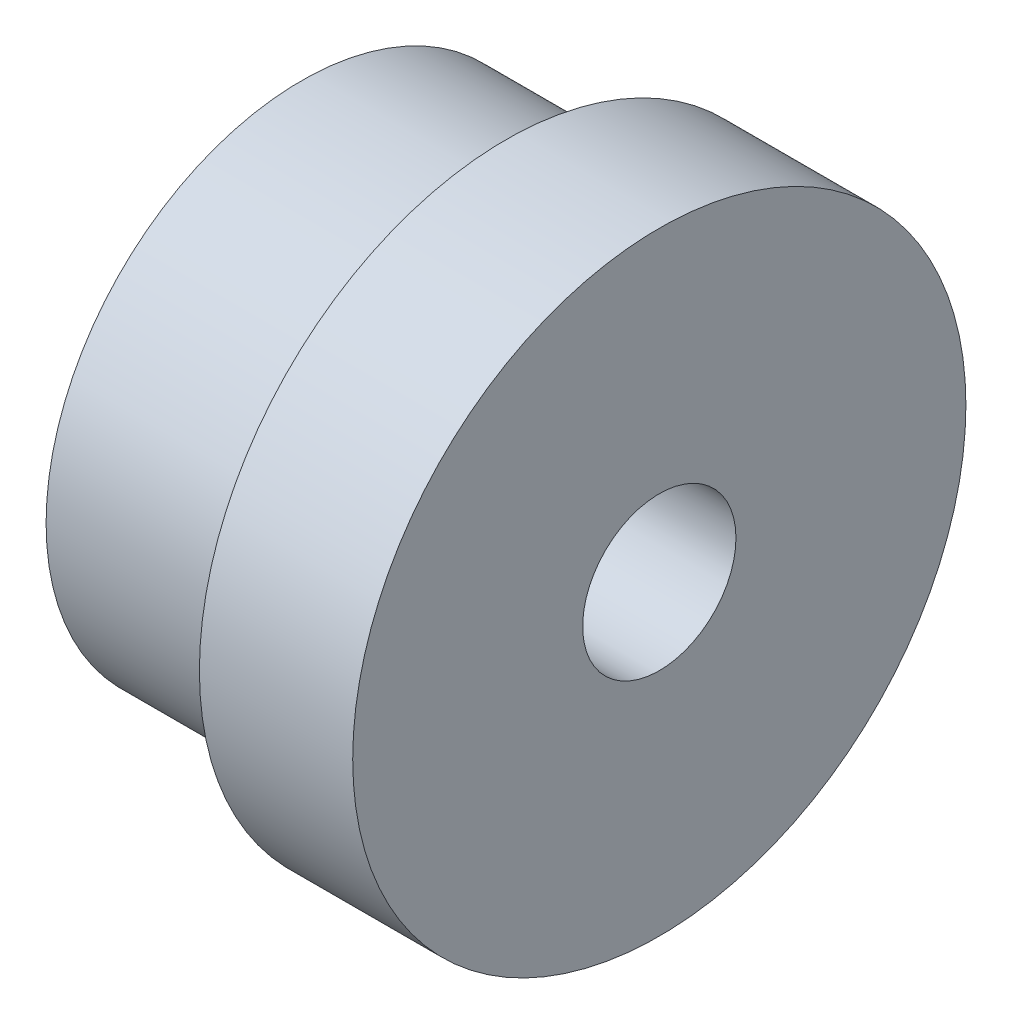
ISO-10303-21;
HEADER;
FILE_DESCRIPTION(('STEP AP214'),'2;1');
FILE_NAME('part.step','',(''),(''),'','','');
FILE_SCHEMA(('AUTOMOTIVE_DESIGN { 1 0 10303 214 1 1 1 1 }'));
ENDSEC;
DATA;
#1=APPLICATION_CONTEXT('core data for automotive mechanical design processes');
#2=APPLICATION_PROTOCOL_DEFINITION('international standard','automotive_design',2000,#1);
#3=PRODUCT_CONTEXT('',#1,'mechanical');
#4=PRODUCT('Part','Part','',(#3));
#5=PRODUCT_RELATED_PRODUCT_CATEGORY('part','',(#4));
#6=PRODUCT_DEFINITION_FORMATION('','',#4);
#7=PRODUCT_DEFINITION_CONTEXT('part definition',#1,'design');
#8=PRODUCT_DEFINITION('design','',#6,#7);
#9=PRODUCT_DEFINITION_SHAPE('','',#8);
#10=(LENGTH_UNIT() NAMED_UNIT(*) SI_UNIT(.MILLI.,.METRE.));
#11=(NAMED_UNIT(*) PLANE_ANGLE_UNIT() SI_UNIT($,.RADIAN.));
#12=(NAMED_UNIT(*) SI_UNIT($,.STERADIAN.) SOLID_ANGLE_UNIT());
#13=UNCERTAINTY_MEASURE_WITH_UNIT(LENGTH_MEASURE(1.E-05),#10,'distance_accuracy_value','');
#14=(GEOMETRIC_REPRESENTATION_CONTEXT(3) GLOBAL_UNCERTAINTY_ASSIGNED_CONTEXT((#13)) GLOBAL_UNIT_ASSIGNED_CONTEXT((#10,
#11,#12)) REPRESENTATION_CONTEXT('',''));
#15=CARTESIAN_POINT('',(0.,0.,0.));
#16=DIRECTION('',(0.,0.,1.));
#17=DIRECTION('',(1.,0.,0.));
#18=AXIS2_PLACEMENT_3D('',#15,#16,#17);
#19=CARTESIAN_POINT('',(0.,0.,0.));
#20=DIRECTION('',(1.,0.,0.));
#21=DIRECTION('',(0.,0.,-1.));
#22=AXIS2_PLACEMENT_3D('',#19,#20,#21);
#23=PLANE('',#22);
#24=CARTESIAN_POINT('',(0.,0.,0.));
#25=DIRECTION('',(1.,0.,0.));
#26=DIRECTION('',(0.,0.,-1.));
#27=AXIS2_PLACEMENT_3D('',#24,#25,#26);
#28=CIRCLE('',#27,9.525);
#29=CARTESIAN_POINT('',(0.,0.,9.525));
#30=VERTEX_POINT('',#29);
#31=EDGE_CURVE('E42',#30,#30,#28,.T.);
#32=ORIENTED_EDGE('',*,*,#31,.F.);
#33=EDGE_LOOP('',(#32));
#34=FACE_BOUND('',#33,.T.);
#35=CARTESIAN_POINT('',(0.,0.,0.));
#36=DIRECTION('',(1.,0.,0.));
#37=DIRECTION('',(0.,0.,-1.));
#38=AXIS2_PLACEMENT_3D('',#35,#36,#37);
#39=CIRCLE('',#38,7.9375);
#40=CARTESIAN_POINT('',(0.,0.,-7.9375));
#41=VERTEX_POINT('',#40);
#42=EDGE_CURVE('E10',#41,#41,#39,.F.);
#43=ORIENTED_EDGE('',*,*,#42,.F.);
#44=EDGE_LOOP('',(#43));
#45=FACE_BOUND('',#44,.T.);
#46=ADVANCED_FACE('F31',(#34,#45),#23,.F.);
#47=CARTESIAN_POINT('',(4.7625,0.,0.));
#48=DIRECTION('',(-1.,0.,0.));
#49=DIRECTION('',(0.,0.,1.));
#50=AXIS2_PLACEMENT_3D('',#47,#48,#49);
#51=CYLINDRICAL_SURFACE('',#50,9.525);
#52=CARTESIAN_POINT('',(4.7625,0.,0.));
#53=DIRECTION('',(1.,0.,0.));
#54=DIRECTION('',(0.,0.,-1.));
#55=AXIS2_PLACEMENT_3D('',#52,#53,#54);
#56=CIRCLE('',#55,9.525);
#57=CARTESIAN_POINT('',(4.7625,0.,9.525));
#58=VERTEX_POINT('',#57);
#59=EDGE_CURVE('E38',#58,#58,#56,.T.);
#60=CARTESIAN_POINT('',(4.7625,0.,9.525));
#61=CARTESIAN_POINT('',(4.712890625,0.,9.525));
#62=CARTESIAN_POINT('',(4.66328125,0.,9.525));
#63=CARTESIAN_POINT('',(4.5640625,0.,9.525));
#64=CARTESIAN_POINT('',(4.514453125,0.,9.525));
#65=CARTESIAN_POINT('',(4.415234375,0.,9.525));
#66=CARTESIAN_POINT('',(4.365625,0.,9.525));
#67=CARTESIAN_POINT('',(4.26640625,0.,9.525));
#68=CARTESIAN_POINT('',(4.216796875,0.,9.525));
#69=CARTESIAN_POINT('',(4.117578125,0.,9.525));
#70=CARTESIAN_POINT('',(4.06796875,0.,9.525));
#71=CARTESIAN_POINT('',(3.96875,0.,9.525));
#72=CARTESIAN_POINT('',(3.919140625,0.,9.525));
#73=CARTESIAN_POINT('',(3.819921875,0.,9.525));
#74=CARTESIAN_POINT('',(3.7703125,0.,9.525));
#75=CARTESIAN_POINT('',(3.67109375,0.,9.525));
#76=CARTESIAN_POINT('',(3.621484375,0.,9.525));
#77=CARTESIAN_POINT('',(3.522265625,0.,9.525));
#78=CARTESIAN_POINT('',(3.47265625,0.,9.525));
#79=CARTESIAN_POINT('',(3.3734375,0.,9.525));
#80=CARTESIAN_POINT('',(3.323828125,0.,9.525));
#81=CARTESIAN_POINT('',(3.224609375,0.,9.525));
#82=CARTESIAN_POINT('',(3.175,0.,9.525));
#83=CARTESIAN_POINT('',(3.07578125,0.,9.525));
#84=CARTESIAN_POINT('',(3.026171875,0.,9.525));
#85=CARTESIAN_POINT('',(2.926953125,0.,9.525));
#86=CARTESIAN_POINT('',(2.87734375,0.,9.525));
#87=CARTESIAN_POINT('',(2.778125,0.,9.525));
#88=CARTESIAN_POINT('',(2.728515625,0.,9.525));
#89=CARTESIAN_POINT('',(2.629296875,0.,9.525));
#90=CARTESIAN_POINT('',(2.5796875,0.,9.525));
#91=CARTESIAN_POINT('',(2.48046875,0.,9.525));
#92=CARTESIAN_POINT('',(2.430859375,0.,9.525));
#93=CARTESIAN_POINT('',(2.331640625,0.,9.525));
#94=CARTESIAN_POINT('',(2.28203125,0.,9.525));
#95=CARTESIAN_POINT('',(2.1828125,0.,9.525));
#96=CARTESIAN_POINT('',(2.133203125,0.,9.525));
#97=CARTESIAN_POINT('',(2.033984375,0.,9.525));
#98=CARTESIAN_POINT('',(1.984375,0.,9.525));
#99=CARTESIAN_POINT('',(1.88515625,0.,9.525));
#100=CARTESIAN_POINT('',(1.835546875,0.,9.525));
#101=CARTESIAN_POINT('',(1.736328125,0.,9.525));
#102=CARTESIAN_POINT('',(1.68671875,0.,9.525));
#103=CARTESIAN_POINT('',(1.5875,0.,9.525));
#104=CARTESIAN_POINT('',(1.537890625,0.,9.525));
#105=CARTESIAN_POINT('',(1.438671875,0.,9.525));
#106=CARTESIAN_POINT('',(1.3890625,0.,9.525));
#107=CARTESIAN_POINT('',(1.28984375,0.,9.525));
#108=CARTESIAN_POINT('',(1.240234375,0.,9.525));
#109=CARTESIAN_POINT('',(1.141015625,0.,9.525));
#110=CARTESIAN_POINT('',(1.09140625,0.,9.525));
#111=CARTESIAN_POINT('',(0.992187499999999,0.,9.525));
#112=CARTESIAN_POINT('',(0.942578124999999,0.,9.525));
#113=CARTESIAN_POINT('',(0.843359375,0.,9.525));
#114=CARTESIAN_POINT('',(0.79375,0.,9.525));
#115=CARTESIAN_POINT('',(0.69453125,0.,9.525));
#116=CARTESIAN_POINT('',(0.644921875,0.,9.525));
#117=CARTESIAN_POINT('',(0.545703125,0.,9.525));
#118=CARTESIAN_POINT('',(0.49609375,0.,9.525));
#119=CARTESIAN_POINT('',(0.396875,0.,9.525));
#120=CARTESIAN_POINT('',(0.347265625,0.,9.525));
#121=CARTESIAN_POINT('',(0.248046875,0.,9.525));
#122=CARTESIAN_POINT('',(0.1984375,0.,9.525));
#123=CARTESIAN_POINT('',(0.09921875,0.,9.525));
#124=CARTESIAN_POINT('',(0.049609375,0.,9.525));
#125=CARTESIAN_POINT('',(0.,0.,9.525));
#126=B_SPLINE_CURVE_WITH_KNOTS('',3,(#60,#61,#62,#63,#64,#65,#66,#67,#68,#69,#70,#71,#72,#73,
#74,#75,#76,#77,#78,#79,#80,#81,#82,#83,#84,#85,#86,#87,#88,#89,#90,#91,#92,#93,#94,#95,#96,#97,
#98,#99,#100,#101,#102,#103,#104,#105,#106,#107,#108,#109,#110,#111,#112,#113,#114,#115,#116,
#117,#118,#119,#120,#121,#122,#123,#124,#125),.UNSPECIFIED.,.F.,.F.,(4,2,2,2,2,2,2,2,2,2,2,2,2,
2,2,2,2,2,2,2,2,2,2,2,2,2,2,2,2,2,2,2,4),(0.,0.148828125,0.29765625,0.446484375,0.5953125,
0.744140625,0.892968750000001,1.041796875,1.190625,1.339453125,1.48828125,1.637109375,1.7859375,
1.934765625,2.08359375,2.232421875,2.38125,2.530078125,2.67890625,2.827734375,2.9765625,
3.125390625,3.27421875,3.423046875,3.571875,3.720703125,3.86953125,4.018359375,4.1671875,
4.316015625,4.46484375,4.613671875,4.7625),.UNSPECIFIED.);
#127=EDGE_CURVE('BSEAM33',#58,#30,#126,.T.);
#128=ORIENTED_EDGE('',*,*,#59,.F.);
#129=ORIENTED_EDGE('',*,*,#31,.T.);
#130=ORIENTED_EDGE('',*,*,#127,.T.);
#131=ORIENTED_EDGE('',*,*,#127,.F.);
#132=EDGE_LOOP('',(#128,#130,#129,#131));
#133=FACE_BOUND('',#132,.T.);
#134=ADVANCED_FACE('F33',(#133),#51,.T.);
#135=CARTESIAN_POINT('',(4.7625,0.,0.));
#136=DIRECTION('',(1.,0.,0.));
#137=DIRECTION('',(0.,0.,-1.));
#138=AXIS2_PLACEMENT_3D('',#135,#136,#137);
#139=PLANE('',#138);
#140=CARTESIAN_POINT('',(4.7625,0.,0.));
#141=DIRECTION('',(1.,0.,0.));
#142=DIRECTION('',(0.,0.,-1.));
#143=AXIS2_PLACEMENT_3D('',#140,#141,#142);
#144=CIRCLE('',#143,2.38124999999999);
#145=CARTESIAN_POINT('',(4.7625,0.,-2.38124999999999));
#146=VERTEX_POINT('',#145);
#147=EDGE_CURVE('E54',#146,#146,#144,.T.);
#148=ORIENTED_EDGE('',*,*,#147,.F.);
#149=EDGE_LOOP('',(#148));
#150=FACE_BOUND('',#149,.T.);
#151=ORIENTED_EDGE('',*,*,#59,.T.);
#152=EDGE_LOOP('',(#151));
#153=FACE_BOUND('',#152,.T.);
#154=ADVANCED_FACE('F60',(#150,#153),#139,.T.);
#155=CARTESIAN_POINT('',(-6.35,0.,0.));
#156=DIRECTION('',(1.,0.,0.));
#157=DIRECTION('',(0.,0.,-1.));
#158=AXIS2_PLACEMENT_3D('',#155,#156,#157);
#159=CYLINDRICAL_SURFACE('',#158,7.9375);
#160=CARTESIAN_POINT('',(-6.35,0.,0.));
#161=DIRECTION('',(-1.,0.,0.));
#162=DIRECTION('',(0.,0.,1.));
#163=AXIS2_PLACEMENT_3D('',#160,#161,#162);
#164=CIRCLE('',#163,7.9375);
#165=CARTESIAN_POINT('',(-6.35,0.,7.9375));
#166=VERTEX_POINT('',#165);
#167=EDGE_CURVE('E47',#166,#166,#164,.T.);
#168=ORIENTED_EDGE('',*,*,#167,.F.);
#169=EDGE_LOOP('',(#168));
#170=FACE_BOUND('',#169,.T.);
#171=ORIENTED_EDGE('',*,*,#42,.T.);
#172=EDGE_LOOP('',(#171));
#173=FACE_BOUND('',#172,.T.);
#174=ADVANCED_FACE('F62',(#170,#173),#159,.T.);
#175=CARTESIAN_POINT('',(-6.35,0.,0.));
#176=DIRECTION('',(-1.,0.,0.));
#177=DIRECTION('',(0.,0.,1.));
#178=AXIS2_PLACEMENT_3D('',#175,#176,#177);
#179=PLANE('',#178);
#180=CARTESIAN_POINT('',(-6.35,0.,0.));
#181=DIRECTION('',(1.,0.,0.));
#182=DIRECTION('',(0.,0.,-1.));
#183=AXIS2_PLACEMENT_3D('',#180,#181,#182);
#184=CIRCLE('',#183,2.38125);
#185=CARTESIAN_POINT('',(-6.35,0.,-2.38125));
#186=VERTEX_POINT('',#185);
#187=EDGE_CURVE('E51',#186,#186,#184,.T.);
#188=ORIENTED_EDGE('',*,*,#187,.T.);
#189=EDGE_LOOP('',(#188));
#190=FACE_BOUND('',#189,.T.);
#191=ORIENTED_EDGE('',*,*,#167,.T.);
#192=EDGE_LOOP('',(#191));
#193=FACE_BOUND('',#192,.T.);
#194=ADVANCED_FACE('F69',(#190,#193),#179,.T.);
#195=CARTESIAN_POINT('',(4.7625,0.,0.));
#196=DIRECTION('',(1.,0.,0.));
#197=DIRECTION('',(0.,0.,-1.));
#198=AXIS2_PLACEMENT_3D('',#195,#196,#197);
#199=CYLINDRICAL_SURFACE('',#198,2.38124999999999);
#200=ORIENTED_EDGE('',*,*,#187,.F.);
#201=EDGE_LOOP('',(#200));
#202=FACE_BOUND('',#201,.T.);
#203=ORIENTED_EDGE('',*,*,#147,.T.);
#204=EDGE_LOOP('',(#203));
#205=FACE_BOUND('',#204,.T.);
#206=ADVANCED_FACE('F58',(#202,#205),#199,.F.);
#207=CLOSED_SHELL('',(#46,#134,#154,#174,#194,#206));
#208=MANIFOLD_SOLID_BREP('B2',#207);
#209=ADVANCED_BREP_SHAPE_REPRESENTATION('',(#18,#208),#14);
#210=SHAPE_DEFINITION_REPRESENTATION(#9,#209);
ENDSEC;
END-ISO-10303-21;
